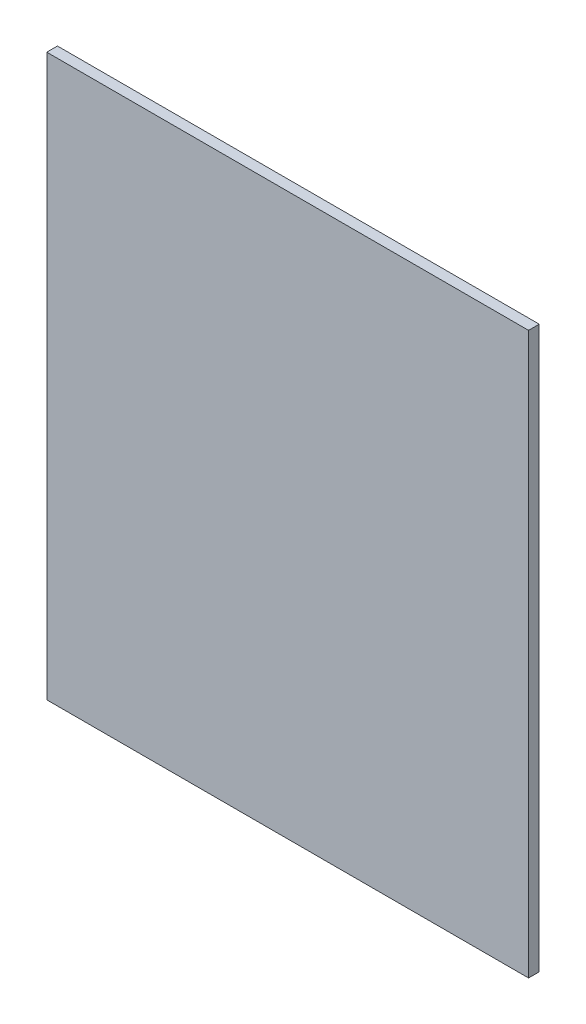
ISO-10303-21;
HEADER;
FILE_DESCRIPTION(('STEP AP214'),'2;1');
FILE_NAME('part.step','',(''),(''),'','','');
FILE_SCHEMA(('AUTOMOTIVE_DESIGN { 1 0 10303 214 1 1 1 1 }'));
ENDSEC;
DATA;
#1=APPLICATION_CONTEXT('core data for automotive mechanical design processes');
#2=APPLICATION_PROTOCOL_DEFINITION('international standard','automotive_design',2000,#1);
#3=PRODUCT_CONTEXT('',#1,'mechanical');
#4=PRODUCT('Part','Part','',(#3));
#5=PRODUCT_RELATED_PRODUCT_CATEGORY('part','',(#4));
#6=PRODUCT_DEFINITION_FORMATION('','',#4);
#7=PRODUCT_DEFINITION_CONTEXT('part definition',#1,'design');
#8=PRODUCT_DEFINITION('design','',#6,#7);
#9=PRODUCT_DEFINITION_SHAPE('','',#8);
#10=(LENGTH_UNIT() NAMED_UNIT(*) SI_UNIT(.MILLI.,.METRE.));
#11=(NAMED_UNIT(*) PLANE_ANGLE_UNIT() SI_UNIT($,.RADIAN.));
#12=(NAMED_UNIT(*) SI_UNIT($,.STERADIAN.) SOLID_ANGLE_UNIT());
#13=UNCERTAINTY_MEASURE_WITH_UNIT(LENGTH_MEASURE(1.E-05),#10,'distance_accuracy_value','');
#14=(GEOMETRIC_REPRESENTATION_CONTEXT(3) GLOBAL_UNCERTAINTY_ASSIGNED_CONTEXT((#13)) GLOBAL_UNIT_ASSIGNED_CONTEXT((#10,
#11,#12)) REPRESENTATION_CONTEXT('',''));
#15=CARTESIAN_POINT('',(0.,0.,0.));
#16=DIRECTION('',(0.,0.,1.));
#17=DIRECTION('',(1.,0.,0.));
#18=AXIS2_PLACEMENT_3D('',#15,#16,#17);
#19=CARTESIAN_POINT('',(429.5,-499.999999999999,19.0499999999865));
#20=DIRECTION('',(-1.,0.,0.));
#21=DIRECTION('',(0.,0.,0.999999999999999));
#22=AXIS2_PLACEMENT_3D('',#19,#20,#21);
#23=PLANE('',#22);
#24=DIRECTION('',(0.,0.999999999999999,0.));
#25=VECTOR('',#24,1.);
#26=CARTESIAN_POINT('',(429.5,-500.,-1.34892097491957E-11));
#27=LINE('',#26,#25);
#28=CARTESIAN_POINT('',(429.5,-500.,-1.34892097491957E-11));
#29=VERTEX_POINT('',#28);
#30=CARTESIAN_POINT('',(429.5,500.,4.44089209850063E-13));
#31=VERTEX_POINT('',#30);
#32=EDGE_CURVE('E91',#29,#31,#27,.T.);
#33=ORIENTED_EDGE('',*,*,#32,.T.);
#34=DIRECTION('',(0.,0.,-0.999999999999999));
#35=VECTOR('',#34,1.);
#36=CARTESIAN_POINT('',(429.5,500.,19.0500000000003));
#37=LINE('',#36,#35);
#38=CARTESIAN_POINT('',(429.5,500.,19.0500000000003));
#39=VERTEX_POINT('',#38);
#40=EDGE_CURVE('E11',#39,#31,#37,.T.);
#41=ORIENTED_EDGE('',*,*,#40,.F.);
#42=DIRECTION('',(0.,0.999999999999999,0.));
#43=VECTOR('',#42,1.);
#44=CARTESIAN_POINT('',(429.5,-499.999999999999,19.0499999999865));
#45=LINE('',#44,#43);
#46=CARTESIAN_POINT('',(429.5,-499.999999999999,19.0499999999865));
#47=VERTEX_POINT('',#46);
#48=EDGE_CURVE('E79',#47,#39,#45,.T.);
#49=ORIENTED_EDGE('',*,*,#48,.F.);
#50=DIRECTION('',(0.,0.,-0.999999999999999));
#51=VECTOR('',#50,1.);
#52=CARTESIAN_POINT('',(429.5,-499.999999999999,19.0499999999865));
#53=LINE('',#52,#51);
#54=EDGE_CURVE('E87',#47,#29,#53,.T.);
#55=ORIENTED_EDGE('',*,*,#54,.T.);
#56=EDGE_LOOP('',(#33,#41,#49,#55));
#57=FACE_BOUND('',#56,.T.);
#58=ADVANCED_FACE('F28',(#57),#23,.F.);
#59=CARTESIAN_POINT('',(-429.5,500.,19.0500000000001));
#60=DIRECTION('',(0.,-0.999999999999999,0.));
#61=DIRECTION('',(0.,0.,-0.999999999999999));
#62=AXIS2_PLACEMENT_3D('',#59,#60,#61);
#63=PLANE('',#62);
#64=DIRECTION('',(-1.,0.,0.));
#65=VECTOR('',#64,1.);
#66=CARTESIAN_POINT('',(-429.5,500.,0.));
#67=LINE('',#66,#65);
#68=CARTESIAN_POINT('',(-429.5,500.,0.));
#69=VERTEX_POINT('',#68);
#70=EDGE_CURVE('E83',#31,#69,#67,.T.);
#71=ORIENTED_EDGE('',*,*,#70,.T.);
#72=DIRECTION('',(0.,0.,-0.999999999999999));
#73=VECTOR('',#72,1.);
#74=CARTESIAN_POINT('',(-429.5,500.,19.0500000000001));
#75=LINE('',#74,#73);
#76=CARTESIAN_POINT('',(-429.5,500.,19.0500000000001));
#77=VERTEX_POINT('',#76);
#78=EDGE_CURVE('E36',#77,#69,#75,.T.);
#79=ORIENTED_EDGE('',*,*,#78,.F.);
#80=DIRECTION('',(-1.,0.,0.));
#81=VECTOR('',#80,1.);
#82=CARTESIAN_POINT('',(-429.5,500.,19.0500000000001));
#83=LINE('',#82,#81);
#84=EDGE_CURVE('E74',#39,#77,#83,.T.);
#85=ORIENTED_EDGE('',*,*,#84,.F.);
#86=ORIENTED_EDGE('',*,*,#40,.T.);
#87=EDGE_LOOP('',(#71,#79,#85,#86));
#88=FACE_BOUND('',#87,.T.);
#89=ADVANCED_FACE('F82',(#88),#63,.F.);
#90=CARTESIAN_POINT('',(-429.5,-500.,19.0499999999861));
#91=DIRECTION('',(1.,0.,0.));
#92=DIRECTION('',(0.,0.,-0.999999999999999));
#93=AXIS2_PLACEMENT_3D('',#90,#91,#92);
#94=PLANE('',#93);
#95=DIRECTION('',(0.,-0.999999999999999,0.));
#96=VECTOR('',#95,1.);
#97=CARTESIAN_POINT('',(-429.5,-500.,-1.37667655053519E-11));
#98=LINE('',#97,#96);
#99=CARTESIAN_POINT('',(-429.5,-500.,-1.37667655053519E-11));
#100=VERTEX_POINT('',#99);
#101=EDGE_CURVE('E61',#69,#100,#98,.T.);
#102=ORIENTED_EDGE('',*,*,#101,.T.);
#103=DIRECTION('',(0.,0.,-0.999999999999999));
#104=VECTOR('',#103,1.);
#105=CARTESIAN_POINT('',(-429.5,-500.,19.0499999999861));
#106=LINE('',#105,#104);
#107=CARTESIAN_POINT('',(-429.5,-500.,19.0499999999861));
#108=VERTEX_POINT('',#107);
#109=EDGE_CURVE('E84',#108,#100,#106,.T.);
#110=ORIENTED_EDGE('',*,*,#109,.F.);
#111=DIRECTION('',(0.,-0.999999999999999,0.));
#112=VECTOR('',#111,1.);
#113=CARTESIAN_POINT('',(-429.5,-500.,19.0499999999861));
#114=LINE('',#113,#112);
#115=EDGE_CURVE('E77',#77,#108,#114,.T.);
#116=ORIENTED_EDGE('',*,*,#115,.F.);
#117=ORIENTED_EDGE('',*,*,#78,.T.);
#118=EDGE_LOOP('',(#102,#110,#116,#117));
#119=FACE_BOUND('',#118,.T.);
#120=ADVANCED_FACE('F85',(#119),#94,.F.);
#121=CARTESIAN_POINT('',(-429.5,-500.,19.0499999999861));
#122=DIRECTION('',(0.,0.999999999999999,0.));
#123=DIRECTION('',(0.,0.,0.999999999999999));
#124=AXIS2_PLACEMENT_3D('',#121,#122,#123);
#125=PLANE('',#124);
#126=DIRECTION('',(1.,0.,0.));
#127=VECTOR('',#126,1.);
#128=CARTESIAN_POINT('',(-429.5,-500.,-1.37667655053519E-11));
#129=LINE('',#128,#127);
#130=EDGE_CURVE('E67',#100,#29,#129,.T.);
#131=ORIENTED_EDGE('',*,*,#130,.T.);
#132=ORIENTED_EDGE('',*,*,#54,.F.);
#133=DIRECTION('',(1.,0.,0.));
#134=VECTOR('',#133,1.);
#135=CARTESIAN_POINT('',(-429.5,-500.,19.0499999999861));
#136=LINE('',#135,#134);
#137=EDGE_CURVE('E44',#108,#47,#136,.T.);
#138=ORIENTED_EDGE('',*,*,#137,.F.);
#139=ORIENTED_EDGE('',*,*,#109,.T.);
#140=EDGE_LOOP('',(#131,#132,#138,#139));
#141=FACE_BOUND('',#140,.T.);
#142=ADVANCED_FACE('F98',(#141),#125,.F.);
#143=CARTESIAN_POINT('',(0.,3.33066907387547E-13,19.05));
#144=DIRECTION('',(0.,0.,-0.999999999999999));
#145=DIRECTION('',(-1.,0.,0.));
#146=AXIS2_PLACEMENT_3D('',#143,#144,#145);
#147=PLANE('',#146);
#148=ORIENTED_EDGE('',*,*,#48,.T.);
#149=ORIENTED_EDGE('',*,*,#84,.T.);
#150=ORIENTED_EDGE('',*,*,#115,.T.);
#151=ORIENTED_EDGE('',*,*,#137,.T.);
#152=EDGE_LOOP('',(#148,#149,#150,#151));
#153=FACE_BOUND('',#152,.T.);
#154=ADVANCED_FACE('F75',(#153),#147,.F.);
#155=CARTESIAN_POINT('',(0.,0.,0.));
#156=DIRECTION('',(0.,0.,-0.999999999999999));
#157=DIRECTION('',(-1.,0.,0.));
#158=AXIS2_PLACEMENT_3D('',#155,#156,#157);
#159=PLANE('',#158);
#160=ORIENTED_EDGE('',*,*,#32,.F.);
#161=ORIENTED_EDGE('',*,*,#130,.F.);
#162=ORIENTED_EDGE('',*,*,#101,.F.);
#163=ORIENTED_EDGE('',*,*,#70,.F.);
#164=EDGE_LOOP('',(#160,#161,#162,#163));
#165=FACE_BOUND('',#164,.T.);
#166=ADVANCED_FACE('F101',(#165),#159,.T.);
#167=CLOSED_SHELL('',(#58,#89,#120,#142,#154,#166));
#168=MANIFOLD_SOLID_BREP('B2',#167);
#169=ADVANCED_BREP_SHAPE_REPRESENTATION('',(#18,#168),#14);
#170=SHAPE_DEFINITION_REPRESENTATION(#9,#169);
ENDSEC;
END-ISO-10303-21;
